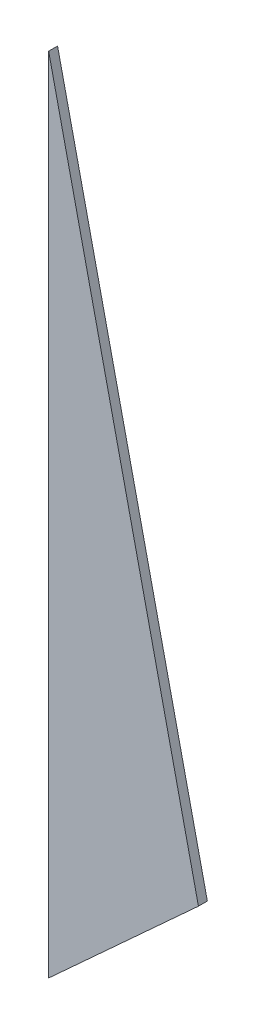
ISO-10303-21;
HEADER;
FILE_DESCRIPTION(('STEP AP214'),'2;1');
FILE_NAME('part.step','',(''),(''),'','','');
FILE_SCHEMA(('AUTOMOTIVE_DESIGN { 1 0 10303 214 1 1 1 1 }'));
ENDSEC;
DATA;
#1=APPLICATION_CONTEXT('core data for automotive mechanical design processes');
#2=APPLICATION_PROTOCOL_DEFINITION('international standard','automotive_design',2000,#1);
#3=PRODUCT_CONTEXT('',#1,'mechanical');
#4=PRODUCT('Part','Part','',(#3));
#5=PRODUCT_RELATED_PRODUCT_CATEGORY('part','',(#4));
#6=PRODUCT_DEFINITION_FORMATION('','',#4);
#7=PRODUCT_DEFINITION_CONTEXT('part definition',#1,'design');
#8=PRODUCT_DEFINITION('design','',#6,#7);
#9=PRODUCT_DEFINITION_SHAPE('','',#8);
#10=(LENGTH_UNIT() NAMED_UNIT(*) SI_UNIT(.MILLI.,.METRE.));
#11=(NAMED_UNIT(*) PLANE_ANGLE_UNIT() SI_UNIT($,.RADIAN.));
#12=(NAMED_UNIT(*) SI_UNIT($,.STERADIAN.) SOLID_ANGLE_UNIT());
#13=UNCERTAINTY_MEASURE_WITH_UNIT(LENGTH_MEASURE(1.E-05),#10,'distance_accuracy_value','');
#14=(GEOMETRIC_REPRESENTATION_CONTEXT(3) GLOBAL_UNCERTAINTY_ASSIGNED_CONTEXT((#13)) GLOBAL_UNIT_ASSIGNED_CONTEXT((#10,
#11,#12)) REPRESENTATION_CONTEXT('',''));
#15=CARTESIAN_POINT('',(0.,0.,0.));
#16=DIRECTION('',(0.,0.,1.));
#17=DIRECTION('',(1.,0.,0.));
#18=AXIS2_PLACEMENT_3D('',#15,#16,#17);
#19=CARTESIAN_POINT('',(0.,45.,0.5));
#20=DIRECTION('',(-0.97560398425353,-0.219537846187479,0.));
#21=DIRECTION('',(0.219537846187479,-0.975603984253531,0.));
#22=AXIS2_PLACEMENT_3D('',#19,#20,#21);
#23=PLANE('',#22);
#24=DIRECTION('',(-0.219537846187479,0.97560398425353,0.));
#25=VECTOR('',#24,1.);
#26=CARTESIAN_POINT('',(0.,45.,-0.5));
#27=LINE('',#26,#25);
#28=CARTESIAN_POINT('',(16.794320409414,-29.6322613107116,-0.5));
#29=VERTEX_POINT('',#28);
#30=CARTESIAN_POINT('',(0.,45.,-0.5));
#31=VERTEX_POINT('',#30);
#32=EDGE_CURVE('E84',#29,#31,#27,.T.);
#33=ORIENTED_EDGE('',*,*,#32,.T.);
#34=DIRECTION('',(0.,0.,-1.));
#35=VECTOR('',#34,1.);
#36=CARTESIAN_POINT('',(0.,45.,0.5));
#37=LINE('',#36,#35);
#38=CARTESIAN_POINT('',(0.,45.,0.5));
#39=VERTEX_POINT('',#38);
#40=EDGE_CURVE('E11',#39,#31,#37,.T.);
#41=ORIENTED_EDGE('',*,*,#40,.F.);
#42=DIRECTION('',(-0.219537846187479,0.97560398425353,0.));
#43=VECTOR('',#42,1.);
#44=CARTESIAN_POINT('',(0.,45.,0.5));
#45=LINE('',#44,#43);
#46=CARTESIAN_POINT('',(16.794320409414,-29.6322613107116,0.5));
#47=VERTEX_POINT('',#46);
#48=EDGE_CURVE('E77',#47,#39,#45,.T.);
#49=ORIENTED_EDGE('',*,*,#48,.F.);
#50=DIRECTION('',(0.,0.,-1.));
#51=VECTOR('',#50,1.);
#52=CARTESIAN_POINT('',(16.794320409414,-29.6322613107116,0.5));
#53=LINE('',#52,#51);
#54=EDGE_CURVE('E85',#47,#29,#53,.T.);
#55=ORIENTED_EDGE('',*,*,#54,.T.);
#56=EDGE_LOOP('',(#33,#41,#49,#55));
#57=FACE_BOUND('',#56,.T.);
#58=ADVANCED_FACE('F37',(#57),#23,.F.);
#59=CARTESIAN_POINT('',(0.,-45.,0.5));
#60=DIRECTION('',(1.,0.,0.));
#61=DIRECTION('',(0.,1.,0.));
#62=AXIS2_PLACEMENT_3D('',#59,#60,#61);
#63=PLANE('',#62);
#64=DIRECTION('',(0.,-1.,0.));
#65=VECTOR('',#64,1.);
#66=CARTESIAN_POINT('',(0.,-45.,-0.5));
#67=LINE('',#66,#65);
#68=CARTESIAN_POINT('',(0.,-45.,-0.5));
#69=VERTEX_POINT('',#68);
#70=EDGE_CURVE('E65',#31,#69,#67,.T.);
#71=ORIENTED_EDGE('',*,*,#70,.T.);
#72=DIRECTION('',(0.,0.,-1.));
#73=VECTOR('',#72,1.);
#74=CARTESIAN_POINT('',(0.,-45.,0.5));
#75=LINE('',#74,#73);
#76=CARTESIAN_POINT('',(0.,-45.,0.5));
#77=VERTEX_POINT('',#76);
#78=EDGE_CURVE('E45',#77,#69,#75,.T.);
#79=ORIENTED_EDGE('',*,*,#78,.F.);
#80=DIRECTION('',(0.,-1.,0.));
#81=VECTOR('',#80,1.);
#82=CARTESIAN_POINT('',(0.,-45.,0.5));
#83=LINE('',#82,#81);
#84=EDGE_CURVE('E73',#39,#77,#83,.T.);
#85=ORIENTED_EDGE('',*,*,#84,.F.);
#86=ORIENTED_EDGE('',*,*,#40,.T.);
#87=EDGE_LOOP('',(#71,#79,#85,#86));
#88=FACE_BOUND('',#87,.T.);
#89=ADVANCED_FACE('F74',(#88),#63,.F.);
#90=CARTESIAN_POINT('',(0.,-45.,0.5));
#91=DIRECTION('',(-0.67507855317929,0.737745855316962,0.));
#92=DIRECTION('',(-0.737745855316962,-0.67507855317929,0.));
#93=AXIS2_PLACEMENT_3D('',#90,#91,#92);
#94=PLANE('',#93);
#95=DIRECTION('',(0.737745855316962,0.67507855317929,0.));
#96=VECTOR('',#95,1.);
#97=CARTESIAN_POINT('',(0.,-45.,-0.5));
#98=LINE('',#97,#96);
#99=EDGE_CURVE('E70',#69,#29,#98,.T.);
#100=ORIENTED_EDGE('',*,*,#99,.T.);
#101=ORIENTED_EDGE('',*,*,#54,.F.);
#102=DIRECTION('',(0.737745855316962,0.67507855317929,0.));
#103=VECTOR('',#102,1.);
#104=CARTESIAN_POINT('',(0.,-45.,0.5));
#105=LINE('',#104,#103);
#106=EDGE_CURVE('E53',#77,#47,#105,.T.);
#107=ORIENTED_EDGE('',*,*,#106,.F.);
#108=ORIENTED_EDGE('',*,*,#78,.T.);
#109=EDGE_LOOP('',(#100,#101,#107,#108));
#110=FACE_BOUND('',#109,.T.);
#111=ADVANCED_FACE('F92',(#110),#94,.F.);
#112=CARTESIAN_POINT('',(0.,0.,0.5));
#113=DIRECTION('',(0.,0.,1.));
#114=DIRECTION('',(1.,0.,0.));
#115=AXIS2_PLACEMENT_3D('',#112,#113,#114);
#116=PLANE('',#115);
#117=ORIENTED_EDGE('',*,*,#48,.T.);
#118=ORIENTED_EDGE('',*,*,#84,.T.);
#119=ORIENTED_EDGE('',*,*,#106,.T.);
#120=EDGE_LOOP('',(#117,#118,#119));
#121=FACE_BOUND('',#120,.T.);
#122=ADVANCED_FACE('F80',(#121),#116,.T.);
#123=CARTESIAN_POINT('',(0.,0.,-0.5));
#124=DIRECTION('',(0.,0.,1.));
#125=DIRECTION('',(1.,0.,0.));
#126=AXIS2_PLACEMENT_3D('',#123,#124,#125);
#127=PLANE('',#126);
#128=ORIENTED_EDGE('',*,*,#32,.F.);
#129=ORIENTED_EDGE('',*,*,#99,.F.);
#130=ORIENTED_EDGE('',*,*,#70,.F.);
#131=EDGE_LOOP('',(#128,#129,#130));
#132=FACE_BOUND('',#131,.T.);
#133=ADVANCED_FACE('F93',(#132),#127,.F.);
#134=CLOSED_SHELL('',(#58,#89,#111,#122,#133));
#135=MANIFOLD_SOLID_BREP('B2',#134);
#136=ADVANCED_BREP_SHAPE_REPRESENTATION('',(#18,#135),#14);
#137=SHAPE_DEFINITION_REPRESENTATION(#9,#136);
ENDSEC;
END-ISO-10303-21;
